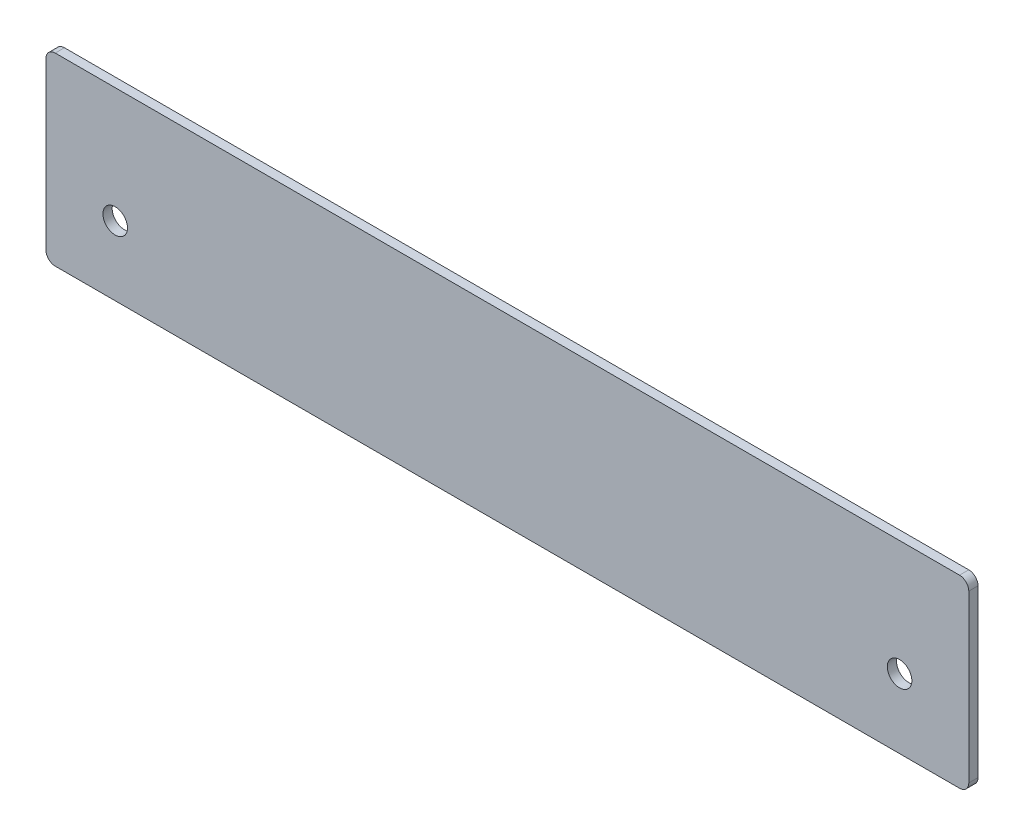
ISO-10303-21;
HEADER;
FILE_DESCRIPTION(('STEP AP214'),'2;1');
FILE_NAME('part.step','',(''),(''),'','','');
FILE_SCHEMA(('AUTOMOTIVE_DESIGN { 1 0 10303 214 1 1 1 1 }'));
ENDSEC;
DATA;
#1=APPLICATION_CONTEXT('core data for automotive mechanical design processes');
#2=APPLICATION_PROTOCOL_DEFINITION('international standard','automotive_design',2000,#1);
#3=PRODUCT_CONTEXT('',#1,'mechanical');
#4=PRODUCT('Part','Part','',(#3));
#5=PRODUCT_RELATED_PRODUCT_CATEGORY('part','',(#4));
#6=PRODUCT_DEFINITION_FORMATION('','',#4);
#7=PRODUCT_DEFINITION_CONTEXT('part definition',#1,'design');
#8=PRODUCT_DEFINITION('design','',#6,#7);
#9=PRODUCT_DEFINITION_SHAPE('','',#8);
#10=(LENGTH_UNIT() NAMED_UNIT(*) SI_UNIT(.MILLI.,.METRE.));
#11=(NAMED_UNIT(*) PLANE_ANGLE_UNIT() SI_UNIT($,.RADIAN.));
#12=(NAMED_UNIT(*) SI_UNIT($,.STERADIAN.) SOLID_ANGLE_UNIT());
#13=UNCERTAINTY_MEASURE_WITH_UNIT(LENGTH_MEASURE(1.E-05),#10,'distance_accuracy_value','');
#14=(GEOMETRIC_REPRESENTATION_CONTEXT(3) GLOBAL_UNCERTAINTY_ASSIGNED_CONTEXT((#13)) GLOBAL_UNIT_ASSIGNED_CONTEXT((#10,
#11,#12)) REPRESENTATION_CONTEXT('',''));
#15=CARTESIAN_POINT('',(0.,0.,0.));
#16=DIRECTION('',(0.,0.,1.));
#17=DIRECTION('',(1.,0.,0.));
#18=AXIS2_PLACEMENT_3D('',#15,#16,#17);
#19=CARTESIAN_POINT('',(-124.46,-22.86,2.53999999999999));
#20=DIRECTION('',(0.,0.,-1.));
#21=DIRECTION('',(-1.,0.,0.));
#22=AXIS2_PLACEMENT_3D('',#19,#20,#21);
#23=CYLINDRICAL_SURFACE('',#22,2.54);
#24=CARTESIAN_POINT('',(-124.46,-22.86,0.));
#25=DIRECTION('',(0.,0.,1.));
#26=DIRECTION('',(1.,0.,0.));
#27=AXIS2_PLACEMENT_3D('',#24,#25,#26);
#28=CIRCLE('',#27,2.54);
#29=CARTESIAN_POINT('',(-127.,-22.86,0.));
#30=VERTEX_POINT('',#29);
#31=CARTESIAN_POINT('',(-124.46,-25.4,0.));
#32=VERTEX_POINT('',#31);
#33=EDGE_CURVE('E140',#30,#32,#28,.T.);
#34=ORIENTED_EDGE('',*,*,#33,.T.);
#35=DIRECTION('',(0.,0.,-1.));
#36=VECTOR('',#35,1.);
#37=CARTESIAN_POINT('',(-124.46,-25.4,2.53999999999999));
#38=LINE('',#37,#36);
#39=CARTESIAN_POINT('',(-124.46,-25.4,2.53999999999999));
#40=VERTEX_POINT('',#39);
#41=EDGE_CURVE('E11',#40,#32,#38,.T.);
#42=ORIENTED_EDGE('',*,*,#41,.F.);
#43=CARTESIAN_POINT('',(-124.46,-22.86,2.53999999999999));
#44=DIRECTION('',(0.,0.,1.));
#45=DIRECTION('',(1.,0.,0.));
#46=AXIS2_PLACEMENT_3D('',#43,#44,#45);
#47=CIRCLE('',#46,2.54);
#48=CARTESIAN_POINT('',(-127.,-22.86,2.53999999999999));
#49=VERTEX_POINT('',#48);
#50=EDGE_CURVE('E155',#49,#40,#47,.T.);
#51=ORIENTED_EDGE('',*,*,#50,.F.);
#52=DIRECTION('',(0.,0.,-1.));
#53=VECTOR('',#52,1.);
#54=CARTESIAN_POINT('',(-127.,-22.86,2.53999999999999));
#55=LINE('',#54,#53);
#56=EDGE_CURVE('E136',#49,#30,#55,.T.);
#57=ORIENTED_EDGE('',*,*,#56,.T.);
#58=EDGE_LOOP('',(#34,#42,#51,#57));
#59=FACE_BOUND('',#58,.T.);
#60=ADVANCED_FACE('F44',(#59),#23,.T.);
#61=CARTESIAN_POINT('',(-124.46,-25.4,2.53999999999999));
#62=DIRECTION('',(0.,1.,0.));
#63=DIRECTION('',(0.,0.,1.));
#64=AXIS2_PLACEMENT_3D('',#61,#62,#63);
#65=PLANE('',#64);
#66=DIRECTION('',(1.,0.,0.));
#67=VECTOR('',#66,1.);
#68=CARTESIAN_POINT('',(-124.46,-25.4,0.));
#69=LINE('',#68,#67);
#70=CARTESIAN_POINT('',(124.46,-25.4,0.));
#71=VERTEX_POINT('',#70);
#72=EDGE_CURVE('E143',#32,#71,#69,.T.);
#73=ORIENTED_EDGE('',*,*,#72,.T.);
#74=DIRECTION('',(0.,0.,-1.));
#75=VECTOR('',#74,1.);
#76=CARTESIAN_POINT('',(124.46,-25.4,2.53999999999999));
#77=LINE('',#76,#75);
#78=CARTESIAN_POINT('',(124.46,-25.4,2.53999999999999));
#79=VERTEX_POINT('',#78);
#80=EDGE_CURVE('E52',#79,#71,#77,.T.);
#81=ORIENTED_EDGE('',*,*,#80,.F.);
#82=DIRECTION('',(1.,0.,0.));
#83=VECTOR('',#82,1.);
#84=CARTESIAN_POINT('',(-124.46,-25.4,2.53999999999999));
#85=LINE('',#84,#83);
#86=EDGE_CURVE('E103',#40,#79,#85,.T.);
#87=ORIENTED_EDGE('',*,*,#86,.F.);
#88=ORIENTED_EDGE('',*,*,#41,.T.);
#89=EDGE_LOOP('',(#73,#81,#87,#88));
#90=FACE_BOUND('',#89,.T.);
#91=ADVANCED_FACE('F224',(#90),#65,.F.);
#92=CARTESIAN_POINT('',(124.46,-22.86,2.53999999999999));
#93=DIRECTION('',(0.,0.,-1.));
#94=DIRECTION('',(-1.,0.,0.));
#95=AXIS2_PLACEMENT_3D('',#92,#93,#94);
#96=CYLINDRICAL_SURFACE('',#95,2.54);
#97=CARTESIAN_POINT('',(124.46,-22.86,0.));
#98=DIRECTION('',(0.,0.,1.));
#99=DIRECTION('',(1.,0.,0.));
#100=AXIS2_PLACEMENT_3D('',#97,#98,#99);
#101=CIRCLE('',#100,2.54);
#102=CARTESIAN_POINT('',(127.,-22.86,0.));
#103=VERTEX_POINT('',#102);
#104=EDGE_CURVE('E146',#71,#103,#101,.T.);
#105=ORIENTED_EDGE('',*,*,#104,.T.);
#106=DIRECTION('',(0.,0.,-1.));
#107=VECTOR('',#106,1.);
#108=CARTESIAN_POINT('',(127.,-22.86,2.53999999999999));
#109=LINE('',#108,#107);
#110=CARTESIAN_POINT('',(127.,-22.86,2.53999999999999));
#111=VERTEX_POINT('',#110);
#112=EDGE_CURVE('E162',#111,#103,#109,.T.);
#113=ORIENTED_EDGE('',*,*,#112,.F.);
#114=CARTESIAN_POINT('',(124.46,-22.86,2.53999999999999));
#115=DIRECTION('',(0.,0.,1.));
#116=DIRECTION('',(1.,0.,0.));
#117=AXIS2_PLACEMENT_3D('',#114,#115,#116);
#118=CIRCLE('',#117,2.54);
#119=EDGE_CURVE('E170',#79,#111,#118,.T.);
#120=ORIENTED_EDGE('',*,*,#119,.F.);
#121=ORIENTED_EDGE('',*,*,#80,.T.);
#122=EDGE_LOOP('',(#105,#113,#120,#121));
#123=FACE_BOUND('',#122,.T.);
#124=ADVANCED_FACE('F168',(#123),#96,.T.);
#125=CARTESIAN_POINT('',(127.,22.86,2.53999999999999));
#126=DIRECTION('',(-1.,0.,0.));
#127=DIRECTION('',(0.,0.,1.));
#128=AXIS2_PLACEMENT_3D('',#125,#126,#127);
#129=PLANE('',#128);
#130=DIRECTION('',(0.,1.,0.));
#131=VECTOR('',#130,1.);
#132=CARTESIAN_POINT('',(127.,22.86,0.));
#133=LINE('',#132,#131);
#134=CARTESIAN_POINT('',(127.,22.86,0.));
#135=VERTEX_POINT('',#134);
#136=EDGE_CURVE('E148',#103,#135,#133,.T.);
#137=ORIENTED_EDGE('',*,*,#136,.T.);
#138=DIRECTION('',(0.,0.,-1.));
#139=VECTOR('',#138,1.);
#140=CARTESIAN_POINT('',(127.,22.86,2.53999999999999));
#141=LINE('',#140,#139);
#142=CARTESIAN_POINT('',(127.,22.86,2.53999999999999));
#143=VERTEX_POINT('',#142);
#144=EDGE_CURVE('E159',#143,#135,#141,.T.);
#145=ORIENTED_EDGE('',*,*,#144,.F.);
#146=DIRECTION('',(0.,1.,0.));
#147=VECTOR('',#146,1.);
#148=CARTESIAN_POINT('',(127.,22.86,2.53999999999999));
#149=LINE('',#148,#147);
#150=EDGE_CURVE('E182',#111,#143,#149,.T.);
#151=ORIENTED_EDGE('',*,*,#150,.F.);
#152=ORIENTED_EDGE('',*,*,#112,.T.);
#153=EDGE_LOOP('',(#137,#145,#151,#152));
#154=FACE_BOUND('',#153,.T.);
#155=ADVANCED_FACE('F178',(#154),#129,.F.);
#156=CARTESIAN_POINT('',(124.46,22.86,2.53999999999999));
#157=DIRECTION('',(0.,0.,-1.));
#158=DIRECTION('',(-1.,0.,0.));
#159=AXIS2_PLACEMENT_3D('',#156,#157,#158);
#160=CYLINDRICAL_SURFACE('',#159,2.54);
#161=CARTESIAN_POINT('',(124.46,22.86,0.));
#162=DIRECTION('',(0.,0.,1.));
#163=DIRECTION('',(-1.,0.,0.));
#164=AXIS2_PLACEMENT_3D('',#161,#162,#163);
#165=CIRCLE('',#164,2.54);
#166=CARTESIAN_POINT('',(124.46,25.4,0.));
#167=VERTEX_POINT('',#166);
#168=EDGE_CURVE('E150',#135,#167,#165,.T.);
#169=ORIENTED_EDGE('',*,*,#168,.T.);
#170=DIRECTION('',(0.,0.,-1.));
#171=VECTOR('',#170,1.);
#172=CARTESIAN_POINT('',(124.46,25.4,2.53999999999999));
#173=LINE('',#172,#171);
#174=CARTESIAN_POINT('',(124.46,25.4,2.53999999999999));
#175=VERTEX_POINT('',#174);
#176=EDGE_CURVE('E131',#175,#167,#173,.T.);
#177=ORIENTED_EDGE('',*,*,#176,.F.);
#178=CARTESIAN_POINT('',(124.46,22.86,2.53999999999999));
#179=DIRECTION('',(0.,0.,1.));
#180=DIRECTION('',(-1.,0.,0.));
#181=AXIS2_PLACEMENT_3D('',#178,#179,#180);
#182=CIRCLE('',#181,2.54);
#183=EDGE_CURVE('E122',#143,#175,#182,.T.);
#184=ORIENTED_EDGE('',*,*,#183,.F.);
#185=ORIENTED_EDGE('',*,*,#144,.T.);
#186=EDGE_LOOP('',(#169,#177,#184,#185));
#187=FACE_BOUND('',#186,.T.);
#188=ADVANCED_FACE('F181',(#187),#160,.T.);
#189=CARTESIAN_POINT('',(-124.46,25.4,2.53999999999999));
#190=DIRECTION('',(0.,-1.,0.));
#191=DIRECTION('',(0.,0.,-1.));
#192=AXIS2_PLACEMENT_3D('',#189,#190,#191);
#193=PLANE('',#192);
#194=DIRECTION('',(-1.,0.,0.));
#195=VECTOR('',#194,1.);
#196=CARTESIAN_POINT('',(-124.46,25.4,0.));
#197=LINE('',#196,#195);
#198=CARTESIAN_POINT('',(-124.46,25.4,0.));
#199=VERTEX_POINT('',#198);
#200=EDGE_CURVE('E130',#167,#199,#197,.T.);
#201=ORIENTED_EDGE('',*,*,#200,.T.);
#202=DIRECTION('',(0.,0.,-1.));
#203=VECTOR('',#202,1.);
#204=CARTESIAN_POINT('',(-124.46,25.4,2.53999999999999));
#205=LINE('',#204,#203);
#206=CARTESIAN_POINT('',(-124.46,25.4,2.53999999999999));
#207=VERTEX_POINT('',#206);
#208=EDGE_CURVE('E127',#207,#199,#205,.T.);
#209=ORIENTED_EDGE('',*,*,#208,.F.);
#210=DIRECTION('',(-1.,0.,0.));
#211=VECTOR('',#210,1.);
#212=CARTESIAN_POINT('',(-124.46,25.4,2.53999999999999));
#213=LINE('',#212,#211);
#214=EDGE_CURVE('E116',#175,#207,#213,.T.);
#215=ORIENTED_EDGE('',*,*,#214,.F.);
#216=ORIENTED_EDGE('',*,*,#176,.T.);
#217=EDGE_LOOP('',(#201,#209,#215,#216));
#218=FACE_BOUND('',#217,.T.);
#219=ADVANCED_FACE('F128',(#218),#193,.F.);
#220=CARTESIAN_POINT('',(-124.46,22.86,2.53999999999999));
#221=DIRECTION('',(0.,0.,-1.));
#222=DIRECTION('',(-1.,0.,0.));
#223=AXIS2_PLACEMENT_3D('',#220,#221,#222);
#224=CYLINDRICAL_SURFACE('',#223,2.54);
#225=CARTESIAN_POINT('',(-124.46,22.86,0.));
#226=DIRECTION('',(0.,0.,1.));
#227=DIRECTION('',(1.,0.,0.));
#228=AXIS2_PLACEMENT_3D('',#225,#226,#227);
#229=CIRCLE('',#228,2.54);
#230=CARTESIAN_POINT('',(-127.,22.86,0.));
#231=VERTEX_POINT('',#230);
#232=EDGE_CURVE('E89',#199,#231,#229,.T.);
#233=ORIENTED_EDGE('',*,*,#232,.T.);
#234=DIRECTION('',(0.,0.,-1.));
#235=VECTOR('',#234,1.);
#236=CARTESIAN_POINT('',(-127.,22.86,2.53999999999999));
#237=LINE('',#236,#235);
#238=CARTESIAN_POINT('',(-127.,22.86,2.53999999999999));
#239=VERTEX_POINT('',#238);
#240=EDGE_CURVE('E132',#239,#231,#237,.T.);
#241=ORIENTED_EDGE('',*,*,#240,.F.);
#242=CARTESIAN_POINT('',(-124.46,22.86,2.53999999999999));
#243=DIRECTION('',(0.,0.,1.));
#244=DIRECTION('',(1.,0.,0.));
#245=AXIS2_PLACEMENT_3D('',#242,#243,#244);
#246=CIRCLE('',#245,2.54);
#247=EDGE_CURVE('E120',#207,#239,#246,.T.);
#248=ORIENTED_EDGE('',*,*,#247,.F.);
#249=ORIENTED_EDGE('',*,*,#208,.T.);
#250=EDGE_LOOP('',(#233,#241,#248,#249));
#251=FACE_BOUND('',#250,.T.);
#252=ADVANCED_FACE('F134',(#251),#224,.T.);
#253=CARTESIAN_POINT('',(-127.,22.86,2.53999999999999));
#254=DIRECTION('',(1.,0.,0.));
#255=DIRECTION('',(0.,0.,-1.));
#256=AXIS2_PLACEMENT_3D('',#253,#254,#255);
#257=PLANE('',#256);
#258=DIRECTION('',(0.,-1.,0.));
#259=VECTOR('',#258,1.);
#260=CARTESIAN_POINT('',(-127.,22.86,0.));
#261=LINE('',#260,#259);
#262=EDGE_CURVE('E95',#231,#30,#261,.T.);
#263=ORIENTED_EDGE('',*,*,#262,.T.);
#264=ORIENTED_EDGE('',*,*,#56,.F.);
#265=DIRECTION('',(0.,-1.,0.));
#266=VECTOR('',#265,1.);
#267=CARTESIAN_POINT('',(-127.,22.86,2.53999999999999));
#268=LINE('',#267,#266);
#269=EDGE_CURVE('E60',#239,#49,#268,.T.);
#270=ORIENTED_EDGE('',*,*,#269,.F.);
#271=ORIENTED_EDGE('',*,*,#240,.T.);
#272=EDGE_LOOP('',(#263,#264,#270,#271));
#273=FACE_BOUND('',#272,.T.);
#274=ADVANCED_FACE('F211',(#273),#257,.F.);
#275=CARTESIAN_POINT('',(-124.46,-22.86,2.53999999999999));
#276=DIRECTION('',(0.,0.,1.));
#277=DIRECTION('',(1.,0.,0.));
#278=AXIS2_PLACEMENT_3D('',#275,#276,#277);
#279=PLANE('',#278);
#280=CARTESIAN_POINT('',(107.95,-6.34999999999999,2.53999999999999));
#281=DIRECTION('',(0.,0.,1.));
#282=DIRECTION('',(1.,0.,0.));
#283=AXIS2_PLACEMENT_3D('',#280,#281,#282);
#284=CIRCLE('',#283,3.37819999999999);
#285=CARTESIAN_POINT('',(111.3282,-6.34999999999999,2.53999999999999));
#286=VERTEX_POINT('',#285);
#287=EDGE_CURVE('E194',#286,#286,#284,.T.);
#288=ORIENTED_EDGE('',*,*,#287,.F.);
#289=EDGE_LOOP('',(#288));
#290=FACE_BOUND('',#289,.T.);
#291=CARTESIAN_POINT('',(-107.95,-6.34999999999999,2.53999999999999));
#292=DIRECTION('',(0.,0.,1.));
#293=DIRECTION('',(1.,0.,0.));
#294=AXIS2_PLACEMENT_3D('',#291,#292,#293);
#295=CIRCLE('',#294,3.37819999999999);
#296=CARTESIAN_POINT('',(-104.5718,-6.34999999999999,2.53999999999999));
#297=VERTEX_POINT('',#296);
#298=EDGE_CURVE('E188',#297,#297,#295,.T.);
#299=ORIENTED_EDGE('',*,*,#298,.F.);
#300=EDGE_LOOP('',(#299));
#301=FACE_BOUND('',#300,.T.);
#302=ORIENTED_EDGE('',*,*,#50,.T.);
#303=ORIENTED_EDGE('',*,*,#86,.T.);
#304=ORIENTED_EDGE('',*,*,#119,.T.);
#305=ORIENTED_EDGE('',*,*,#150,.T.);
#306=ORIENTED_EDGE('',*,*,#183,.T.);
#307=ORIENTED_EDGE('',*,*,#214,.T.);
#308=ORIENTED_EDGE('',*,*,#247,.T.);
#309=ORIENTED_EDGE('',*,*,#269,.T.);
#310=EDGE_LOOP('',(#302,#303,#304,#305,#306,#307,#308,#309));
#311=FACE_BOUND('',#310,.T.);
#312=ADVANCED_FACE('F118',(#290,#301,#311),#279,.T.);
#313=CARTESIAN_POINT('',(-124.46,-22.86,0.));
#314=DIRECTION('',(0.,0.,1.));
#315=DIRECTION('',(1.,0.,0.));
#316=AXIS2_PLACEMENT_3D('',#313,#314,#315);
#317=PLANE('',#316);
#318=CARTESIAN_POINT('',(107.95,-6.34999999999999,0.));
#319=DIRECTION('',(0.,0.,1.));
#320=DIRECTION('',(1.,0.,0.));
#321=AXIS2_PLACEMENT_3D('',#318,#319,#320);
#322=CIRCLE('',#321,3.37819999999999);
#323=CARTESIAN_POINT('',(111.3282,-6.34999999999999,0.));
#324=VERTEX_POINT('',#323);
#325=EDGE_CURVE('E191',#324,#324,#322,.T.);
#326=ORIENTED_EDGE('',*,*,#325,.T.);
#327=EDGE_LOOP('',(#326));
#328=FACE_BOUND('',#327,.T.);
#329=CARTESIAN_POINT('',(-107.95,-6.34999999999999,0.));
#330=DIRECTION('',(0.,0.,1.));
#331=DIRECTION('',(1.,0.,0.));
#332=AXIS2_PLACEMENT_3D('',#329,#330,#331);
#333=CIRCLE('',#332,3.37819999999999);
#334=CARTESIAN_POINT('',(-104.5718,-6.34999999999999,0.));
#335=VERTEX_POINT('',#334);
#336=EDGE_CURVE('E144',#335,#335,#333,.T.);
#337=ORIENTED_EDGE('',*,*,#336,.T.);
#338=EDGE_LOOP('',(#337));
#339=FACE_BOUND('',#338,.T.);
#340=ORIENTED_EDGE('',*,*,#33,.F.);
#341=ORIENTED_EDGE('',*,*,#262,.F.);
#342=ORIENTED_EDGE('',*,*,#232,.F.);
#343=ORIENTED_EDGE('',*,*,#200,.F.);
#344=ORIENTED_EDGE('',*,*,#168,.F.);
#345=ORIENTED_EDGE('',*,*,#136,.F.);
#346=ORIENTED_EDGE('',*,*,#104,.F.);
#347=ORIENTED_EDGE('',*,*,#72,.F.);
#348=EDGE_LOOP('',(#340,#341,#342,#343,#344,#345,#346,#347));
#349=FACE_BOUND('',#348,.T.);
#350=ADVANCED_FACE('F174',(#328,#339,#349),#317,.F.);
#351=CARTESIAN_POINT('',(-107.95,-6.34999999999999,0.));
#352=DIRECTION('',(0.,0.,1.));
#353=DIRECTION('',(1.,0.,0.));
#354=AXIS2_PLACEMENT_3D('',#351,#352,#353);
#355=CYLINDRICAL_SURFACE('',#354,3.37819999999999);
#356=ORIENTED_EDGE('',*,*,#336,.F.);
#357=EDGE_LOOP('',(#356));
#358=FACE_BOUND('',#357,.T.);
#359=ORIENTED_EDGE('',*,*,#298,.T.);
#360=EDGE_LOOP('',(#359));
#361=FACE_BOUND('',#360,.T.);
#362=ADVANCED_FACE('F205',(#358,#361),#355,.F.);
#363=CARTESIAN_POINT('',(107.95,-6.34999999999999,0.));
#364=DIRECTION('',(0.,0.,1.));
#365=DIRECTION('',(1.,0.,0.));
#366=AXIS2_PLACEMENT_3D('',#363,#364,#365);
#367=CYLINDRICAL_SURFACE('',#366,3.37819999999999);
#368=ORIENTED_EDGE('',*,*,#325,.F.);
#369=EDGE_LOOP('',(#368));
#370=FACE_BOUND('',#369,.T.);
#371=ORIENTED_EDGE('',*,*,#287,.T.);
#372=EDGE_LOOP('',(#371));
#373=FACE_BOUND('',#372,.T.);
#374=ADVANCED_FACE('F202',(#370,#373),#367,.F.);
#375=CLOSED_SHELL('',(#60,#91,#124,#155,#188,#219,#252,#274,#312,#350,#362,#374));
#376=MANIFOLD_SOLID_BREP('B2',#375);
#377=ADVANCED_BREP_SHAPE_REPRESENTATION('',(#18,#376),#14);
#378=SHAPE_DEFINITION_REPRESENTATION(#9,#377);
ENDSEC;
END-ISO-10303-21;
